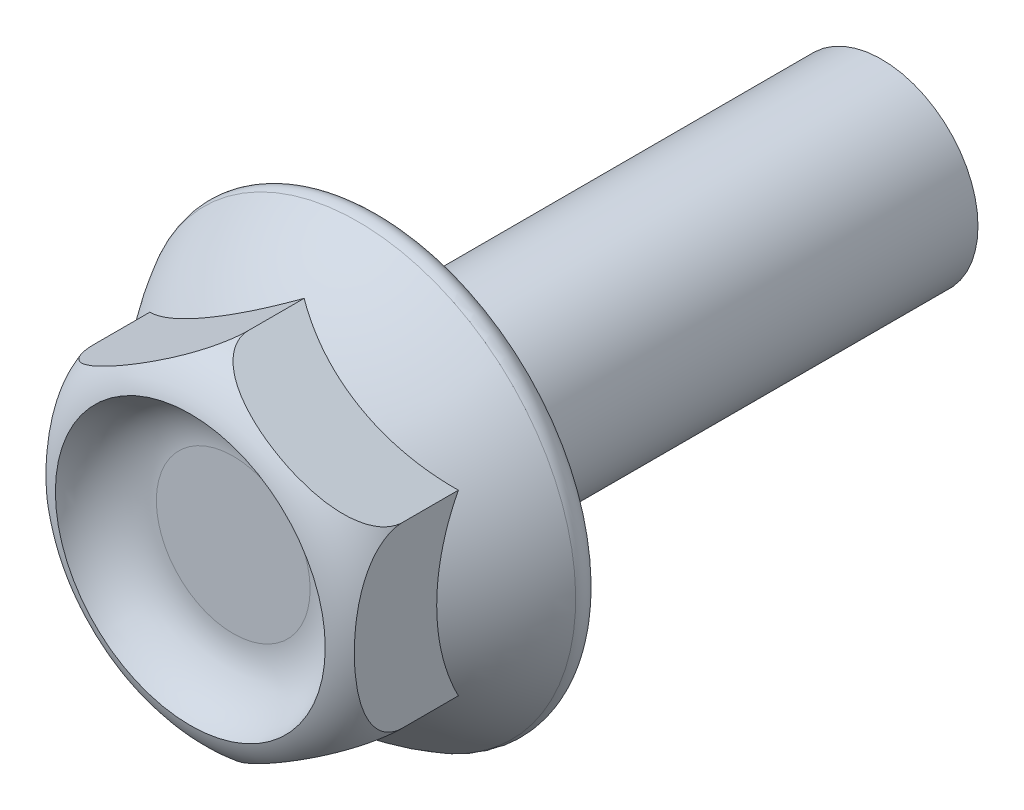
ISO-10303-21;
HEADER;
FILE_DESCRIPTION(('STEP AP214'),'2;1');
FILE_NAME('part.step','',(''),(''),'','','');
FILE_SCHEMA(('AUTOMOTIVE_DESIGN { 1 0 10303 214 1 1 1 1 }'));
ENDSEC;
DATA;
#1=APPLICATION_CONTEXT('core data for automotive mechanical design processes');
#2=APPLICATION_PROTOCOL_DEFINITION('international standard','automotive_design',2000,#1);
#3=PRODUCT_CONTEXT('',#1,'mechanical');
#4=PRODUCT('Part','Part','',(#3));
#5=PRODUCT_RELATED_PRODUCT_CATEGORY('part','',(#4));
#6=PRODUCT_DEFINITION_FORMATION('','',#4);
#7=PRODUCT_DEFINITION_CONTEXT('part definition',#1,'design');
#8=PRODUCT_DEFINITION('design','',#6,#7);
#9=PRODUCT_DEFINITION_SHAPE('','',#8);
#10=(LENGTH_UNIT() NAMED_UNIT(*) SI_UNIT(.MILLI.,.METRE.));
#11=(NAMED_UNIT(*) PLANE_ANGLE_UNIT() SI_UNIT($,.RADIAN.));
#12=(NAMED_UNIT(*) SI_UNIT($,.STERADIAN.) SOLID_ANGLE_UNIT());
#13=UNCERTAINTY_MEASURE_WITH_UNIT(LENGTH_MEASURE(1.E-05),#10,'distance_accuracy_value','');
#14=(GEOMETRIC_REPRESENTATION_CONTEXT(3) GLOBAL_UNCERTAINTY_ASSIGNED_CONTEXT((#13)) GLOBAL_UNIT_ASSIGNED_CONTEXT((#10,
#11,#12)) REPRESENTATION_CONTEXT('',''));
#15=CARTESIAN_POINT('',(0.,0.,0.));
#16=DIRECTION('',(0.,0.,1.));
#17=DIRECTION('',(1.,0.,0.));
#18=AXIS2_PLACEMENT_3D('',#15,#16,#17);
#19=CARTESIAN_POINT('',(0.,5.86587873496659,6.35));
#20=DIRECTION('',(0.500000000000001,0.866025403784438,0.));
#21=DIRECTION('',(-0.866025403784438,0.500000000000001,0.));
#22=AXIS2_PLACEMENT_3D('',#19,#20,#21);
#23=PLANE('',#22);
#24=DIRECTION('',(0.,0.,-1.));
#25=VECTOR('',#24,1.);
#26=CARTESIAN_POINT('',(0.,5.86587873496659,6.35));
#27=LINE('',#26,#25);
#28=CARTESIAN_POINT('',(0.,5.86587873496659,4.35));
#29=VERTEX_POINT('',#28);
#30=CARTESIAN_POINT('',(0.,5.86587873496659,2.51392725610466));
#31=VERTEX_POINT('',#30);
#32=EDGE_CURVE('E55',#29,#31,#27,.T.);
#33=ORIENTED_EDGE('',*,*,#32,.F.);
#34=CARTESIAN_POINT('',(1.73205119371237E-08,5.8658787249666,4.3498));
#35=CARTESIAN_POINT('',(-8.8332409814021E-06,5.86588383484065,4.37921735965277));
#36=CARTESIAN_POINT('',(0.00111489781830148,5.86523504841107,4.40861944868109));
#37=CARTESIAN_POINT('',(0.00558293377875098,5.86265542664656,4.46718078982089));
#38=CARTESIAN_POINT('',(0.00892592825202911,5.86072534788751,4.49634017496175));
#39=CARTESIAN_POINT('',(0.0221503107941925,5.85309024706693,4.58273944081772));
#40=CARTESIAN_POINT('',(0.0352285829072238,5.84553950314193,4.63936235222589));
#41=CARTESIAN_POINT('',(0.069022324886228,5.82602867711343,4.74927598053388));
#42=CARTESIAN_POINT('',(0.0897222004156251,5.81407759840434,4.80257324334787));
#43=CARTESIAN_POINT('',(0.137620523637703,5.78642348859834,4.9051880333948));
#44=CARTESIAN_POINT('',(0.164830697141963,5.77071368760096,4.95449816242364));
#45=CARTESIAN_POINT('',(0.239507067617073,5.72759926500505,5.07221484281395));
#46=CARTESIAN_POINT('',(0.290292388570505,5.69827834628171,5.13781456561909));
#47=CARTESIAN_POINT('',(0.400235584140341,5.6348026127239,5.25884259644683));
#48=CARTESIAN_POINT('',(0.459412108573482,5.60063703041271,5.3142475984221));
#49=CARTESIAN_POINT('',(0.618171503908423,5.5089772507797,5.44406160729553));
#50=CARTESIAN_POINT('',(0.721838162918047,5.44912527729451,5.51176114370447));
#51=CARTESIAN_POINT('',(0.936619233993736,5.32512136809212,5.62852759447626));
#52=CARTESIAN_POINT('',(1.04774787285762,5.26096121852938,5.67755765515471));
#53=CARTESIAN_POINT('',(1.26675794761726,5.13451569291166,5.75809401771096));
#54=CARTESIAN_POINT('',(1.37439290383616,5.07237262196447,5.79052010797972));
#55=CARTESIAN_POINT('',(1.59169629684474,4.94691244951515,5.84478770919572));
#56=CARTESIAN_POINT('',(1.70136658982473,4.88359427634104,5.8666190101469));
#57=CARTESIAN_POINT('',(1.92225717724184,4.75606303623432,5.90147382211741));
#58=CARTESIAN_POINT('',(2.03348237581865,4.69184713789533,5.91445471648294));
#59=CARTESIAN_POINT('',(2.25635349466679,4.56317243743376,5.93251260991884));
#60=CARTESIAN_POINT('',(2.36799923384862,4.49871373986326,5.93759269094453));
#61=CARTESIAN_POINT('',(2.60551753956472,4.36158248212061,5.94047120308278));
#62=CARTESIAN_POINT('',(2.73139985349996,4.28890429428388,5.93726516120935));
#63=CARTESIAN_POINT('',(2.98279387964846,4.14376188561438,5.9210478616658));
#64=CARTESIAN_POINT('',(3.10830528013154,4.07129784475911,5.90802991057953));
#65=CARTESIAN_POINT('',(3.35727136280954,3.92755720990588,5.87091883959326));
#66=CARTESIAN_POINT('',(3.48073419812838,3.85627590869963,5.84690072877571));
#67=CARTESIAN_POINT('',(3.72504839958597,3.71522103872124,5.78543143579168));
#68=CARTESIAN_POINT('',(3.84590368481327,3.64544520726227,5.74800215477668));
#69=CARTESIAN_POINT('',(4.04367664608343,3.53126093483451,5.67132288322251));
#70=CARTESIAN_POINT('',(4.12194187341124,3.48607448476861,5.63674290108095));
#71=CARTESIAN_POINT('',(4.27517213493171,3.39760695203177,5.55854944732659));
#72=CARTESIAN_POINT('',(4.3501340591906,3.35432766488193,5.51492767460828));
#73=CARTESIAN_POINT('',(4.49546818484468,3.27041896831311,5.41675845997038));
#74=CARTESIAN_POINT('',(4.56579441950804,3.22981609779912,5.36211864222592));
#75=CARTESIAN_POINT('',(4.69816688001565,3.15339082209176,5.24071561558516));
#76=CARTESIAN_POINT('',(4.76022923926691,3.11755910227151,5.17397664787848));
#77=CARTESIAN_POINT('',(4.85461371573109,3.06306619937759,5.05034498953979));
#78=CARTESIAN_POINT('',(4.89019869719668,3.04252120074932,4.99678608914583));
#79=CARTESIAN_POINT('',(4.95365430110938,3.00588509074874,4.8838301073324));
#80=CARTESIAN_POINT('',(4.98153101035409,2.98979046516218,4.82443768284238));
#81=CARTESIAN_POINT('',(5.02475483276112,2.96483517966007,4.70876570874048));
#82=CARTESIAN_POINT('',(5.04124870984452,2.955312435286,4.65306014147761));
#83=CARTESIAN_POINT('',(5.0658589379944,2.94110371343884,4.53929930283942));
#84=CARTESIAN_POINT('',(5.07399454706269,2.93640661735325,4.48124975462469));
#85=CARTESIAN_POINT('',(5.07924213680267,2.93337692000427,4.39855439433402));
#86=CARTESIAN_POINT('',(5.08001600533595,2.93293012679826,4.37417167502324));
#87=CARTESIAN_POINT('',(5.07999998267959,2.93293937748323,4.34980000000001));
#88=B_SPLINE_CURVE_WITH_KNOTS('',3,(#34,#35,#36,#37,#38,#39,#40,#41,#42,#43,#44,#45,#46,#47,#48,
#49,#50,#51,#52,#53,#54,#55,#56,#57,#58,#59,#60,#61,#62,#63,#64,#65,#66,#67,#68,#69,#70,#71,#72,
#73,#74,#75,#76,#77,#78,#79,#80,#81,#82,#83,#84,#85,#86,#87),.UNSPECIFIED.,.F.,.F.,(4,2,2,2,2,2,
2,2,2,2,2,2,2,2,2,2,2,2,2,2,2,2,2,2,2,2,4),(0.,0.0881936096410174,0.176335189095027,
0.35125145478558,0.525811800468274,0.700688948534251,0.963163648168834,1.2262311292228,
1.63647394701996,2.0475224399795,2.43229689210506,2.81744141132249,3.20442763074213,
3.59126285638533,4.02712536158759,4.46328546968383,4.89651473390057,5.32903971237568,
5.61894358996784,5.90911481142715,6.20182834379283,6.49396176572394,6.69578887974842,
6.89745616392338,7.07332096542269,7.2487796478312,7.32190975611919),.UNSPECIFIED.);
#89=CARTESIAN_POINT('',(5.08,2.93293936748328,4.35));
#90=VERTEX_POINT('',#89);
#91=EDGE_CURVE('E48',#29,#90,#88,.T.);
#92=ORIENTED_EDGE('',*,*,#91,.T.);
#93=DIRECTION('',(0.,0.,-1.));
#94=VECTOR('',#93,1.);
#95=CARTESIAN_POINT('',(5.08,2.93293936748328,6.35));
#96=LINE('',#95,#94);
#97=CARTESIAN_POINT('',(5.08,2.93293936748328,2.51392725610466));
#98=VERTEX_POINT('',#97);
#99=EDGE_CURVE('E95',#90,#98,#96,.T.);
#100=ORIENTED_EDGE('',*,*,#99,.T.);
#101=CARTESIAN_POINT('',(2.54,4.39940905122494,-3.163295125));
#102=DIRECTION('',(0.500000000000001,0.866025403784438,0.));
#103=DIRECTION('',(-0.866025403784438,0.500000000000001,0.));
#104=AXIS2_PLACEMENT_3D('',#101,#102,#103);
#105=CIRCLE('',#104,6.39006942824951);
#106=EDGE_CURVE('E111',#98,#31,#105,.F.);
#107=ORIENTED_EDGE('',*,*,#106,.T.);
#108=EDGE_LOOP('',(#33,#92,#100,#107));
#109=FACE_BOUND('',#108,.T.);
#110=ADVANCED_FACE('F32',(#109),#23,.T.);
#111=CARTESIAN_POINT('',(5.08,2.93293936748328,6.35));
#112=DIRECTION('',(1.,0.,0.));
#113=DIRECTION('',(0.,0.,-1.));
#114=AXIS2_PLACEMENT_3D('',#111,#112,#113);
#115=PLANE('',#114);
#116=ORIENTED_EDGE('',*,*,#99,.F.);
#117=CARTESIAN_POINT('',(5.08,0.,5.93931103116843));
#118=CARTESIAN_POINT('',(5.08,-0.128406018763927,5.93931222544602));
#119=CARTESIAN_POINT('',(5.08,-0.256815208471439,5.93561800556159));
#120=CARTESIAN_POINT('',(5.08,-0.513257632380873,5.92052867881341));
#121=CARTESIAN_POINT('',(5.08,-0.641290642977389,5.90912966872429));
#122=CARTESIAN_POINT('',(5.08,-0.896091515794616,5.87770867369142));
#123=CARTESIAN_POINT('',(5.08,-1.02286122075891,5.85770203567101));
#124=CARTESIAN_POINT('',(5.08,-1.27430570837632,5.80749417544982));
#125=CARTESIAN_POINT('',(5.08,-1.39898241413378,5.77730291788913));
#126=CARTESIAN_POINT('',(5.08,-1.63060992207727,5.70861727364401));
#127=CARTESIAN_POINT('',(5.08,-1.73795335538443,5.67147283566331));
#128=CARTESIAN_POINT('',(5.08,-1.94803197222505,5.58527369373639));
#129=CARTESIAN_POINT('',(5.08,-2.05076146002238,5.5362047236011));
#130=CARTESIAN_POINT('',(5.08,-2.24973945263147,5.4229872368293));
#131=CARTESIAN_POINT('',(5.08,-2.34587152068299,5.35862913843172));
#132=CARTESIAN_POINT('',(5.08,-2.52424334840148,5.21289028808471));
#133=CARTESIAN_POINT('',(5.08,-2.60654318861829,5.13158678200762));
#134=CARTESIAN_POINT('',(5.08,-2.71790755101677,4.99066893058166));
#135=CARTESIAN_POINT('',(5.08,-2.75454547149407,4.93703319071446));
#136=CARTESIAN_POINT('',(5.08,-2.81888837477423,4.82459627040611));
#137=CARTESIAN_POINT('',(5.08,-2.84659875597864,4.76579823903394));
#138=CARTESIAN_POINT('',(5.08,-2.89138534396048,4.64367398831319));
#139=CARTESIAN_POINT('',(5.08,-2.90837305597831,4.58031477436736));
#140=CARTESIAN_POINT('',(5.08,-2.92988244238737,4.45150975790325));
#141=CARTESIAN_POINT('',(5.08,-2.93441260269651,4.38606540650797));
#142=CARTESIAN_POINT('',(5.08,-2.930828965772,4.26294069689448));
#143=CARTESIAN_POINT('',(5.08,-2.92408128168369,4.20521577048942));
#144=CARTESIAN_POINT('',(5.08,-2.90097579232433,4.09173912708922));
#145=CARTESIAN_POINT('',(5.08,-2.8846170629169,4.03598760039015));
#146=CARTESIAN_POINT('',(5.08,-2.84332976141734,3.92769611905693));
#147=CARTESIAN_POINT('',(5.08,-2.8183874850017,3.87516145937559));
#148=CARTESIAN_POINT('',(5.08,-2.76129989808952,3.77420078371417));
#149=CARTESIAN_POINT('',(5.08,-2.72915156958153,3.72577650097611));
#150=CARTESIAN_POINT('',(5.08,-2.64005138622743,3.60845196973405));
#151=CARTESIAN_POINT('',(5.08,-2.57907635059011,3.54260324604756));
#152=CARTESIAN_POINT('',(5.08,-2.44745592071216,3.42140867324789));
#153=CARTESIAN_POINT('',(5.08,-2.37678610181218,3.36609022198544));
#154=CARTESIAN_POINT('',(5.08,-2.18656061981978,3.2361140772928));
#155=CARTESIAN_POINT('',(5.08,-2.06220013631206,3.16854288811915));
#156=CARTESIAN_POINT('',(5.08,-1.80499132887189,3.05263850719054));
#157=CARTESIAN_POINT('',(5.08,-1.67212664875558,3.00434376380855));
#158=CARTESIAN_POINT('',(5.08,-1.40954660029552,2.92528413579039));
#159=CARTESIAN_POINT('',(5.08,-1.28007493607304,2.89368553204411));
#160=CARTESIAN_POINT('',(5.08,-1.01887286412277,2.84147402207231));
#161=CARTESIAN_POINT('',(5.08,-0.887140363580464,2.82087193196388));
#162=CARTESIAN_POINT('',(5.08,-0.621936123648095,2.78883586654607));
#163=CARTESIAN_POINT('',(5.08,-0.48845900238243,2.7774477872338));
#164=CARTESIAN_POINT('',(5.08,-0.221128150383743,2.7629901948841));
#165=CARTESIAN_POINT('',(5.08,-0.087274601768512,2.75991718331907));
#166=CARTESIAN_POINT('',(5.08,0.196841634949649,2.76190166981298));
#167=CARTESIAN_POINT('',(5.08,0.347098431115192,2.76800525241483));
#168=CARTESIAN_POINT('',(5.08,0.646943625856298,2.79102572066017));
#169=CARTESIAN_POINT('',(5.08,0.796531336117898,2.8079519287503));
#170=CARTESIAN_POINT('',(5.08,1.09302996111681,2.85441671152725));
#171=CARTESIAN_POINT('',(5.08,1.23995057797026,2.88389117131835));
#172=CARTESIAN_POINT('',(5.08,1.52962744946796,2.95852548771936));
#173=CARTESIAN_POINT('',(5.08,1.67239162078481,3.00365307798382));
#174=CARTESIAN_POINT('',(5.08,1.93881383071237,3.10948120211427));
#175=CARTESIAN_POINT('',(5.08,2.06308036955532,3.16861073763079));
#176=CARTESIAN_POINT('',(5.08,2.29903981247179,3.30791618381836));
#177=CARTESIAN_POINT('',(5.08,2.41080117816544,3.38796859284178));
#178=CARTESIAN_POINT('',(5.08,2.56285153954697,3.52750922408576));
#179=CARTESIAN_POINT('',(5.08,2.61141167644839,3.57798090134302));
#180=CARTESIAN_POINT('',(5.08,2.70073176791262,3.68553995274877));
#181=CARTESIAN_POINT('',(5.08,2.74149024334158,3.74262857813123));
#182=CARTESIAN_POINT('',(5.08,2.81319985323495,3.86356204880188));
#183=CARTESIAN_POINT('',(5.08,2.84404594194435,3.92747027251439));
#184=CARTESIAN_POINT('',(5.08,2.89283069774621,4.06004265903072));
#185=CARTESIAN_POINT('',(5.08,2.91078777234826,4.12869988515734));
#186=CARTESIAN_POINT('',(5.08,2.93082892206014,4.26014825179101));
#187=CARTESIAN_POINT('',(5.08,2.93451250440174,4.32269611859209));
#188=CARTESIAN_POINT('',(5.08,2.93013860153054,4.44737352978146));
#189=CARTESIAN_POINT('',(5.08,2.92208339518955,4.50950315301199));
#190=CARTESIAN_POINT('',(5.08,2.89618691459551,4.62560674905295));
#191=CARTESIAN_POINT('',(5.08,2.87931940840787,4.67980363110395));
#192=CARTESIAN_POINT('',(5.08,2.83754728943211,4.78497656057663));
#193=CARTESIAN_POINT('',(5.08,2.81264039856166,4.83595169016382));
#194=CARTESIAN_POINT('',(5.08,2.7451853872528,4.95273820272454));
#195=CARTESIAN_POINT('',(5.08,2.69953409416151,5.01675688748763));
#196=CARTESIAN_POINT('',(5.08,2.59850726503045,5.13657179815197));
#197=CARTESIAN_POINT('',(5.08,2.54311293797314,5.19235174475702));
#198=CARTESIAN_POINT('',(5.08,2.39724114560304,5.32057394950502));
#199=CARTESIAN_POINT('',(5.08,2.30262852443792,5.38828145684921));
#200=CARTESIAN_POINT('',(5.08,2.10421245817008,5.50846181046753));
#201=CARTESIAN_POINT('',(5.08,2.00038658641986,5.56089607381954));
#202=CARTESIAN_POINT('',(5.08,1.79980021554563,5.64760819522685));
#203=CARTESIAN_POINT('',(5.08,1.70363235904793,5.68329190202944));
#204=CARTESIAN_POINT('',(5.08,1.50854845178073,5.746291419206));
#205=CARTESIAN_POINT('',(5.08,1.40963010015192,5.77359997892871));
#206=CARTESIAN_POINT('',(5.08,1.21006932547022,5.82111721450031));
#207=CARTESIAN_POINT('',(5.08,1.10942586120308,5.84132143195831));
#208=CARTESIAN_POINT('',(5.08,0.907159140555265,5.87560134005104));
#209=CARTESIAN_POINT('',(5.08,0.805536263625741,5.88967931373577));
#210=CARTESIAN_POINT('',(5.08,0.586841864309721,5.91410586017958));
#211=CARTESIAN_POINT('',(5.08,0.469677203696405,5.92361196783077));
#212=CARTESIAN_POINT('',(5.08,0.23500925992481,5.93621419115479));
#213=CARTESIAN_POINT('',(5.08,0.117505957685565,5.93930993827004));
#214=CARTESIAN_POINT('',(5.08,0.,5.93931103116843));
#215=B_SPLINE_CURVE_WITH_KNOTS('',3,(#117,#118,#119,#120,#121,#122,#123,#124,#125,#126,#127,
#128,#129,#130,#131,#132,#133,#134,#135,#136,#137,#138,#139,#140,#141,#142,#143,#144,#145,#146,
#147,#148,#149,#150,#151,#152,#153,#154,#155,#156,#157,#158,#159,#160,#161,#162,#163,#164,#165,
#166,#167,#168,#169,#170,#171,#172,#173,#174,#175,#176,#177,#178,#179,#180,#181,#182,#183,#184,
#185,#186,#187,#188,#189,#190,#191,#192,#193,#194,#195,#196,#197,#198,#199,#200,#201,#202,#203,
#204,#205,#206,#207,#208,#209,#210,#211,#212,#213,#214),.UNSPECIFIED.,.T.,.F.,(4,2,2,2,2,2,2,2,
2,2,2,2,2,2,2,2,2,2,2,2,2,2,2,2,2,2,2,2,2,2,2,2,2,2,2,2,2,2,2,2,2,2,2,2,2,2,2,2,4),(0.,
0.385167841014202,0.77053095337983,1.15520981362871,1.5395133901456,1.87972773512272,
2.22035112468588,2.56594461872192,2.90999588883431,3.10418347879689,3.29825342393606,
3.49390478783131,3.68942284357659,3.862928251776,4.03645034587204,4.21025077722695,
4.38412413547961,4.65182364223472,4.92021040924057,5.34241470023154,5.76545695207581,
6.1646865630636,6.56430813408407,6.96590821675103,7.36733930168355,7.81812564204902,
8.26930080705116,8.71819786274777,9.16617503687885,9.57760193389076,9.98665309004678,
10.1961735186034,10.4057336313299,10.6174464274216,10.8288562599478,11.0157449051236,
11.2025972741088,11.3721718568349,11.5417945333528,11.77636512315,12.0113931829203,
12.3584724942416,12.7064211329301,13.013699816655,13.321243775951,13.6289803940773,
13.9366022304475,14.2890538875641,14.6415258079907),.UNSPECIFIED.);
#216=CARTESIAN_POINT('',(5.08,-2.93293936748328,4.35));
#217=VERTEX_POINT('',#216);
#218=EDGE_CURVE('E85',#90,#217,#215,.T.);
#219=ORIENTED_EDGE('',*,*,#218,.T.);
#220=DIRECTION('',(0.,0.,-1.));
#221=VECTOR('',#220,1.);
#222=CARTESIAN_POINT('',(5.08,-2.93293936748328,6.35));
#223=LINE('',#222,#221);
#224=CARTESIAN_POINT('',(5.08,-2.93293936748328,2.51392725610466));
#225=VERTEX_POINT('',#224);
#226=EDGE_CURVE('E103',#217,#225,#223,.T.);
#227=ORIENTED_EDGE('',*,*,#226,.T.);
#228=CARTESIAN_POINT('',(5.08,0.,-3.163295125));
#229=DIRECTION('',(1.,0.,0.));
#230=DIRECTION('',(0.,0.,-1.));
#231=AXIS2_PLACEMENT_3D('',#228,#229,#230);
#232=CIRCLE('',#231,6.3900694282495);
#233=EDGE_CURVE('E102',#225,#98,#232,.F.);
#234=ORIENTED_EDGE('',*,*,#233,.T.);
#235=EDGE_LOOP('',(#116,#219,#227,#234));
#236=FACE_BOUND('',#235,.T.);
#237=ADVANCED_FACE('F100',(#236),#115,.T.);
#238=CARTESIAN_POINT('',(5.08,-2.93293936748328,6.35));
#239=DIRECTION('',(0.500000000000001,-0.866025403784438,0.));
#240=DIRECTION('',(0.866025403784438,0.500000000000001,0.));
#241=AXIS2_PLACEMENT_3D('',#238,#239,#240);
#242=PLANE('',#241);
#243=ORIENTED_EDGE('',*,*,#226,.F.);
#244=CARTESIAN_POINT('',(5.07999998267949,-2.93293937748328,4.3498));
#245=CARTESIAN_POINT('',(5.08000883324098,-2.93293426760923,4.37921735965277));
#246=CARTESIAN_POINT('',(5.0788851021817,-2.9335830540388,4.40861944868109));
#247=CARTESIAN_POINT('',(5.07441706622125,-2.93616267580331,4.46718078982089));
#248=CARTESIAN_POINT('',(5.07107407174797,-2.93809275456236,4.49634017496175));
#249=CARTESIAN_POINT('',(5.05784968920581,-2.94572785538294,4.58273944081772));
#250=CARTESIAN_POINT('',(5.04477141709278,-2.95327859930794,4.63936235222589));
#251=CARTESIAN_POINT('',(5.01097767511377,-2.97278942533644,4.74927598053388));
#252=CARTESIAN_POINT('',(4.99027779958437,-2.98474050404553,4.80257324334787));
#253=CARTESIAN_POINT('',(4.9423794763623,-3.01239461385153,4.9051880333948));
#254=CARTESIAN_POINT('',(4.91516930285804,-3.02810441484891,4.95449816242364));
#255=CARTESIAN_POINT('',(4.84049293238293,-3.07121883744482,5.07221484281395));
#256=CARTESIAN_POINT('',(4.78970761142949,-3.10053975616816,5.13781456561909));
#257=CARTESIAN_POINT('',(4.67976441585966,-3.16401548972598,5.25884259644683));
#258=CARTESIAN_POINT('',(4.62058789142652,-3.19818107203716,5.3142475984221));
#259=CARTESIAN_POINT('',(4.46182849609158,-3.28984085167017,5.44406160729553));
#260=CARTESIAN_POINT('',(4.35816183708195,-3.34969282515536,5.51176114370447));
#261=CARTESIAN_POINT('',(4.14338076600626,-3.47369673435775,5.62852759447626));
#262=CARTESIAN_POINT('',(4.03225212714238,-3.53785688392049,5.67755765515471));
#263=CARTESIAN_POINT('',(3.81324205238273,-3.66430240953821,5.75809401771096));
#264=CARTESIAN_POINT('',(3.70560709616384,-3.7264454804854,5.79052010797972));
#265=CARTESIAN_POINT('',(3.48830370315526,-3.85190565293473,5.84478770919572));
#266=CARTESIAN_POINT('',(3.37863341017527,-3.91522382610883,5.8666190101469));
#267=CARTESIAN_POINT('',(3.15774282275816,-4.04275506621555,5.90147382211741));
#268=CARTESIAN_POINT('',(3.04651762418135,-4.10697096455454,5.91445471648294));
#269=CARTESIAN_POINT('',(2.82364650533321,-4.23564566501611,5.93251260991884));
#270=CARTESIAN_POINT('',(2.71200076615137,-4.30010436258662,5.93759269094453));
#271=CARTESIAN_POINT('',(2.47448246043528,-4.43723562032927,5.94047120308278));
#272=CARTESIAN_POINT('',(2.34860014650004,-4.509913808166,5.93726516120935));
#273=CARTESIAN_POINT('',(2.09720612035154,-4.6550562168355,5.9210478616658));
#274=CARTESIAN_POINT('',(1.97169471986846,-4.72752025769077,5.90802991057953));
#275=CARTESIAN_POINT('',(1.72272863719046,-4.871260892544,5.87091883959326));
#276=CARTESIAN_POINT('',(1.59926580187162,-4.94254219375025,5.84690072877571));
#277=CARTESIAN_POINT('',(1.35495160041403,-5.08359706372863,5.78543143579168));
#278=CARTESIAN_POINT('',(1.23409631518673,-5.1533728951876,5.74800215477668));
#279=CARTESIAN_POINT('',(1.03632335391657,-5.26755716761536,5.67132288322251));
#280=CARTESIAN_POINT('',(0.958058126588757,-5.31274361768126,5.63674290108095));
#281=CARTESIAN_POINT('',(0.804827865068285,-5.4012111504181,5.55854944732659));
#282=CARTESIAN_POINT('',(0.7298659408094,-5.44449043756794,5.51492767460828));
#283=CARTESIAN_POINT('',(0.584531815155313,-5.52839913413677,5.41675845997038));
#284=CARTESIAN_POINT('',(0.514205580491954,-5.56900200465075,5.36211864222592));
#285=CARTESIAN_POINT('',(0.381833119984349,-5.64542728035811,5.24071561558516));
#286=CARTESIAN_POINT('',(0.319770760733093,-5.68125900017837,5.17397664787848));
#287=CARTESIAN_POINT('',(0.22538628426891,-5.73575190307228,5.05034498953979));
#288=CARTESIAN_POINT('',(0.189801302803321,-5.75629690170055,4.99678608914583));
#289=CARTESIAN_POINT('',(0.126345698890618,-5.79293301170114,4.8838301073324));
#290=CARTESIAN_POINT('',(0.0984689896459049,-5.80902763728769,4.82443768284237));
#291=CARTESIAN_POINT('',(0.0552451672388727,-5.8339829227898,4.70876570874048));
#292=CARTESIAN_POINT('',(0.0387512901554802,-5.84350566716388,4.65306014147761));
#293=CARTESIAN_POINT('',(0.0141410620055928,-5.85771438901103,4.53929930283942));
#294=CARTESIAN_POINT('',(0.00600545293730663,-5.86241148509663,4.48124975462469));
#295=CARTESIAN_POINT('',(0.000757863197325228,-5.8654411824456,4.39855439433402));
#296=CARTESIAN_POINT('',(-1.60053359537951E-05,-5.86588797565161,4.37417167502324));
#297=CARTESIAN_POINT('',(1.73204108631173E-08,-5.86587872496664,4.34980000000001));
#298=B_SPLINE_CURVE_WITH_KNOTS('',3,(#244,#245,#246,#247,#248,#249,#250,#251,#252,#253,#254,
#255,#256,#257,#258,#259,#260,#261,#262,#263,#264,#265,#266,#267,#268,#269,#270,#271,#272,#273,
#274,#275,#276,#277,#278,#279,#280,#281,#282,#283,#284,#285,#286,#287,#288,#289,#290,#291,#292,
#293,#294,#295,#296,#297),.UNSPECIFIED.,.F.,.F.,(4,2,2,2,2,2,2,2,2,2,2,2,2,2,2,2,2,2,2,2,2,2,2,
2,2,2,4),(0.,0.0881936096410172,0.176335189095027,0.35125145478558,0.525811800468273,
0.700688948534251,0.963163648168833,1.2262311292228,1.63647394701996,2.0475224399795,
2.43229689210506,2.81744141132249,3.20442763074213,3.59126285638533,4.02712536158759,
4.46328546968383,4.89651473390057,5.32903971237568,5.61894358996784,5.90911481142715,
6.20182834379283,6.49396176572394,6.69578887974842,6.89745616392338,7.07332096542269,
7.2487796478312,7.32190975611919),.UNSPECIFIED.);
#299=CARTESIAN_POINT('',(0.,-5.86587873496659,4.35));
#300=VERTEX_POINT('',#299);
#301=EDGE_CURVE('E88',#217,#300,#298,.T.);
#302=ORIENTED_EDGE('',*,*,#301,.T.);
#303=DIRECTION('',(0.,0.,-1.));
#304=VECTOR('',#303,1.);
#305=CARTESIAN_POINT('',(0.,-5.86587873496659,6.35));
#306=LINE('',#305,#304);
#307=CARTESIAN_POINT('',(0.,-5.86587873496659,2.51392725610466));
#308=VERTEX_POINT('',#307);
#309=EDGE_CURVE('E105',#300,#308,#306,.T.);
#310=ORIENTED_EDGE('',*,*,#309,.T.);
#311=CARTESIAN_POINT('',(2.54,-4.39940905122494,-3.163295125));
#312=DIRECTION('',(0.500000000000001,-0.866025403784438,0.));
#313=DIRECTION('',(0.866025403784438,0.500000000000001,0.));
#314=AXIS2_PLACEMENT_3D('',#311,#312,#313);
#315=CIRCLE('',#314,6.39006942824951);
#316=EDGE_CURVE('E321',#308,#225,#315,.F.);
#317=ORIENTED_EDGE('',*,*,#316,.T.);
#318=EDGE_LOOP('',(#243,#302,#310,#317));
#319=FACE_BOUND('',#318,.T.);
#320=ADVANCED_FACE('F168',(#319),#242,.T.);
#321=CARTESIAN_POINT('',(0.,-5.86587873496659,6.35));
#322=DIRECTION('',(-0.5,-0.866025403784438,0.));
#323=DIRECTION('',(0.866025403784438,-0.500000000000001,0.));
#324=AXIS2_PLACEMENT_3D('',#321,#322,#323);
#325=PLANE('',#324);
#326=ORIENTED_EDGE('',*,*,#309,.F.);
#327=CARTESIAN_POINT('',(-1.73205119371237E-08,-5.8658787249666,4.3498));
#328=CARTESIAN_POINT('',(8.83324098140373E-06,-5.86588383484065,4.37921735965277));
#329=CARTESIAN_POINT('',(-0.00111489781830148,-5.86523504841107,4.40861944868109));
#330=CARTESIAN_POINT('',(-0.00558293377875099,-5.86265542664656,4.46718078982089));
#331=CARTESIAN_POINT('',(-0.00892592825202912,-5.86072534788751,4.49634017496175));
#332=CARTESIAN_POINT('',(-0.0221503107941925,-5.85309024706693,4.58273944081772));
#333=CARTESIAN_POINT('',(-0.0352285829072239,-5.84553950314193,4.63936235222589));
#334=CARTESIAN_POINT('',(-0.0690223248862281,-5.82602867711343,4.74927598053388));
#335=CARTESIAN_POINT('',(-0.0897222004156252,-5.81407759840434,4.80257324334787));
#336=CARTESIAN_POINT('',(-0.137620523637703,-5.78642348859834,4.9051880333948));
#337=CARTESIAN_POINT('',(-0.164830697141963,-5.77071368760096,4.95449816242364));
#338=CARTESIAN_POINT('',(-0.239507067617073,-5.72759926500505,5.07221484281395));
#339=CARTESIAN_POINT('',(-0.290292388570505,-5.69827834628171,5.13781456561909));
#340=CARTESIAN_POINT('',(-0.400235584140341,-5.6348026127239,5.25884259644683));
#341=CARTESIAN_POINT('',(-0.459412108573482,-5.60063703041271,5.3142475984221));
#342=CARTESIAN_POINT('',(-0.618171503908423,-5.50897725077971,5.44406160729553));
#343=CARTESIAN_POINT('',(-0.721838162918046,-5.44912527729451,5.51176114370447));
#344=CARTESIAN_POINT('',(-0.936619233993735,-5.32512136809212,5.62852759447626));
#345=CARTESIAN_POINT('',(-1.04774787285762,-5.26096121852939,5.67755765515471));
#346=CARTESIAN_POINT('',(-1.26675794761726,-5.13451569291166,5.75809401771096));
#347=CARTESIAN_POINT('',(-1.37439290383615,-5.07237262196447,5.79052010797972));
#348=CARTESIAN_POINT('',(-1.59169629684474,-4.94691244951515,5.84478770919572));
#349=CARTESIAN_POINT('',(-1.70136658982473,-4.88359427634105,5.8666190101469));
#350=CARTESIAN_POINT('',(-1.92225717724184,-4.75606303623432,5.90147382211741));
#351=CARTESIAN_POINT('',(-2.03348237581865,-4.69184713789533,5.91445471648294));
#352=CARTESIAN_POINT('',(-2.25635349466679,-4.56317243743377,5.93251260991884));
#353=CARTESIAN_POINT('',(-2.36799923384862,-4.49871373986326,5.93759269094453));
#354=CARTESIAN_POINT('',(-2.60551753956471,-4.36158248212061,5.94047120308278));
#355=CARTESIAN_POINT('',(-2.73139985349996,-4.28890429428388,5.93726516120935));
#356=CARTESIAN_POINT('',(-2.98279387964846,-4.14376188561438,5.9210478616658));
#357=CARTESIAN_POINT('',(-3.10830528013153,-4.07129784475911,5.90802991057953));
#358=CARTESIAN_POINT('',(-3.35727136280953,-3.92755720990588,5.87091883959326));
#359=CARTESIAN_POINT('',(-3.48073419812838,-3.85627590869963,5.84690072877571));
#360=CARTESIAN_POINT('',(-3.72504839958596,-3.71522103872125,5.78543143579168));
#361=CARTESIAN_POINT('',(-3.84590368481326,-3.64544520726227,5.74800215477668));
#362=CARTESIAN_POINT('',(-4.04367664608343,-3.53126093483452,5.67132288322251));
#363=CARTESIAN_POINT('',(-4.12194187341124,-3.48607448476862,5.63674290108095));
#364=CARTESIAN_POINT('',(-4.27517213493171,-3.39760695203178,5.55854944732659));
#365=CARTESIAN_POINT('',(-4.35013405919059,-3.35432766488194,5.51492767460828));
#366=CARTESIAN_POINT('',(-4.49546818484468,-3.27041896831311,5.41675845997038));
#367=CARTESIAN_POINT('',(-4.56579441950804,-3.22981609779913,5.36211864222592));
#368=CARTESIAN_POINT('',(-4.69816688001564,-3.15339082209177,5.24071561558516));
#369=CARTESIAN_POINT('',(-4.7602292392669,-3.11755910227151,5.17397664787848));
#370=CARTESIAN_POINT('',(-4.85461371573109,-3.06306619937759,5.0503449895398));
#371=CARTESIAN_POINT('',(-4.89019869719667,-3.04252120074933,4.99678608914583));
#372=CARTESIAN_POINT('',(-4.95365430110938,-3.00588509074874,4.8838301073324));
#373=CARTESIAN_POINT('',(-4.98153101035409,-2.98979046516218,4.82443768284238));
#374=CARTESIAN_POINT('',(-5.02475483276112,-2.96483517966008,4.70876570874048));
#375=CARTESIAN_POINT('',(-5.04124870984452,-2.955312435286,4.65306014147762));
#376=CARTESIAN_POINT('',(-5.0658589379944,-2.94110371343885,4.53929930283942));
#377=CARTESIAN_POINT('',(-5.07399454706269,-2.93640661735325,4.48124975462469));
#378=CARTESIAN_POINT('',(-5.07924213680267,-2.93337692000427,4.39855439433402));
#379=CARTESIAN_POINT('',(-5.08001600533595,-2.93293012679827,4.37417167502324));
#380=CARTESIAN_POINT('',(-5.07999998267958,-2.93293937748323,4.34980000000001));
#381=B_SPLINE_CURVE_WITH_KNOTS('',3,(#327,#328,#329,#330,#331,#332,#333,#334,#335,#336,#337,
#338,#339,#340,#341,#342,#343,#344,#345,#346,#347,#348,#349,#350,#351,#352,#353,#354,#355,#356,
#357,#358,#359,#360,#361,#362,#363,#364,#365,#366,#367,#368,#369,#370,#371,#372,#373,#374,#375,
#376,#377,#378,#379,#380),.UNSPECIFIED.,.F.,.F.,(4,2,2,2,2,2,2,2,2,2,2,2,2,2,2,2,2,2,2,2,2,2,2,
2,2,2,4),(0.,0.0881936096410174,0.176335189095027,0.35125145478558,0.525811800468274,
0.700688948534251,0.963163648168833,1.2262311292228,1.63647394701996,2.04752243997949,
2.43229689210506,2.81744141132248,3.20442763074213,3.59126285638533,4.02712536158758,
4.46328546968383,4.89651473390056,5.32903971237567,5.61894358996783,5.90911481142714,
6.20182834379282,6.49396176572393,6.69578887974841,6.89745616392337,7.07332096542268,
7.24877964783119,7.32190975611918),.UNSPECIFIED.);
#382=CARTESIAN_POINT('',(-5.08,-2.93293936748328,4.35));
#383=VERTEX_POINT('',#382);
#384=EDGE_CURVE('E145',#300,#383,#381,.T.);
#385=ORIENTED_EDGE('',*,*,#384,.T.);
#386=DIRECTION('',(0.,0.,-1.));
#387=VECTOR('',#386,1.);
#388=CARTESIAN_POINT('',(-5.08,-2.93293936748329,6.35));
#389=LINE('',#388,#387);
#390=CARTESIAN_POINT('',(-5.08,-2.93293936748328,2.51392725610466));
#391=VERTEX_POINT('',#390);
#392=EDGE_CURVE('E317',#383,#391,#389,.T.);
#393=ORIENTED_EDGE('',*,*,#392,.T.);
#394=CARTESIAN_POINT('',(-2.54,-4.39940905122494,-3.163295125));
#395=DIRECTION('',(-0.5,-0.866025403784438,0.));
#396=DIRECTION('',(0.866025403784438,-0.500000000000001,0.));
#397=AXIS2_PLACEMENT_3D('',#394,#395,#396);
#398=CIRCLE('',#397,6.39006942824951);
#399=EDGE_CURVE('E327',#391,#308,#398,.F.);
#400=ORIENTED_EDGE('',*,*,#399,.T.);
#401=EDGE_LOOP('',(#326,#385,#393,#400));
#402=FACE_BOUND('',#401,.T.);
#403=ADVANCED_FACE('F184',(#402),#325,.T.);
#404=CARTESIAN_POINT('',(-5.08,-2.93293936748329,6.35));
#405=DIRECTION('',(-1.,0.,0.));
#406=DIRECTION('',(0.,-1.,0.));
#407=AXIS2_PLACEMENT_3D('',#404,#405,#406);
#408=PLANE('',#407);
#409=ORIENTED_EDGE('',*,*,#392,.F.);
#410=CARTESIAN_POINT('',(-5.08,0.,5.93931103117518));
#411=CARTESIAN_POINT('',(-5.08,0.128406018763668,5.93931222545304));
#412=CARTESIAN_POINT('',(-5.08,0.25681520847092,5.93561800556349));
#413=CARTESIAN_POINT('',(-5.08,0.513257632380122,5.92052867881159));
#414=CARTESIAN_POINT('',(-5.08,0.641290642976666,5.90912966872386));
#415=CARTESIAN_POINT('',(-5.08,0.896091515794102,5.87770867369201));
#416=CARTESIAN_POINT('',(-5.08,1.02286122075858,5.85770203567121));
#417=CARTESIAN_POINT('',(-5.08,1.27430570837622,5.80749417544971));
#418=CARTESIAN_POINT('',(-5.08,1.39898241413372,5.77730291788911));
#419=CARTESIAN_POINT('',(-5.08,1.63060992207731,5.70861727364403));
#420=CARTESIAN_POINT('',(-5.08,1.7379533553845,5.6714728356633));
#421=CARTESIAN_POINT('',(-5.08,1.94803197222512,5.58527369373635));
#422=CARTESIAN_POINT('',(-5.08,2.05076146002241,5.53620472360108));
#423=CARTESIAN_POINT('',(-5.08,2.24973945263146,5.42298723682931));
#424=CARTESIAN_POINT('',(-5.08,2.34587152068297,5.35862913843174));
#425=CARTESIAN_POINT('',(-5.08,2.52424334840145,5.21289028808474));
#426=CARTESIAN_POINT('',(-5.08,2.60654318861827,5.13158678200763));
#427=CARTESIAN_POINT('',(-5.08,2.71790755101677,4.99066893058166));
#428=CARTESIAN_POINT('',(-5.08,2.75454547149407,4.93703319071446));
#429=CARTESIAN_POINT('',(-5.08,2.81888837477423,4.82459627040611));
#430=CARTESIAN_POINT('',(-5.08,2.84659875597864,4.76579823903394));
#431=CARTESIAN_POINT('',(-5.08,2.89138534396048,4.64367398831319));
#432=CARTESIAN_POINT('',(-5.08,2.90837305597831,4.58031477436736));
#433=CARTESIAN_POINT('',(-5.08,2.92988244238737,4.45150975790325));
#434=CARTESIAN_POINT('',(-5.08,2.93441260269651,4.38606540650797));
#435=CARTESIAN_POINT('',(-5.08,2.930828965772,4.26294069689448));
#436=CARTESIAN_POINT('',(-5.08,2.92408128168369,4.20521577048942));
#437=CARTESIAN_POINT('',(-5.08,2.90097579232433,4.09173912708922));
#438=CARTESIAN_POINT('',(-5.08,2.8846170629169,4.03598760039015));
#439=CARTESIAN_POINT('',(-5.08,2.84332976141734,3.92769611905693));
#440=CARTESIAN_POINT('',(-5.08,2.8183874850017,3.87516145937559));
#441=CARTESIAN_POINT('',(-5.08,2.76129989808952,3.77420078371417));
#442=CARTESIAN_POINT('',(-5.08,2.72915156958153,3.72577650097611));
#443=CARTESIAN_POINT('',(-5.08,2.64005138622743,3.60845196973406));
#444=CARTESIAN_POINT('',(-5.08,2.57907635059011,3.54260324604756));
#445=CARTESIAN_POINT('',(-5.08,2.44745592071216,3.4214086732479));
#446=CARTESIAN_POINT('',(-5.08,2.37678610181218,3.36609022198544));
#447=CARTESIAN_POINT('',(-5.08,2.18656061981978,3.2361140772928));
#448=CARTESIAN_POINT('',(-5.08,2.06220013631206,3.16854288811915));
#449=CARTESIAN_POINT('',(-5.08,1.80499132887189,3.05263850719054));
#450=CARTESIAN_POINT('',(-5.08,1.67212664875558,3.00434376380855));
#451=CARTESIAN_POINT('',(-5.08,1.40954660029552,2.92528413579039));
#452=CARTESIAN_POINT('',(-5.08,1.28007493607304,2.89368553204412));
#453=CARTESIAN_POINT('',(-5.08,1.01887286412278,2.84147402207231));
#454=CARTESIAN_POINT('',(-5.08,0.887140363580468,2.82087193196388));
#455=CARTESIAN_POINT('',(-5.08,0.621936123648099,2.78883586654608));
#456=CARTESIAN_POINT('',(-5.08,0.488459002382434,2.7774477872338));
#457=CARTESIAN_POINT('',(-5.08,0.221128150383747,2.7629901948841));
#458=CARTESIAN_POINT('',(-5.08,0.0872746017685165,2.75991718331907));
#459=CARTESIAN_POINT('',(-5.08,-0.196841634949644,2.76190166981298));
#460=CARTESIAN_POINT('',(-5.08,-0.347098431115187,2.76800525241483));
#461=CARTESIAN_POINT('',(-5.08,-0.646943625856294,2.79102572066016));
#462=CARTESIAN_POINT('',(-5.08,-0.796531336117893,2.8079519287503));
#463=CARTESIAN_POINT('',(-5.08,-1.09302996111681,2.85441671152725));
#464=CARTESIAN_POINT('',(-5.08,-1.23995057797026,2.88389117131835));
#465=CARTESIAN_POINT('',(-5.08,-1.52962744946796,2.95852548771936));
#466=CARTESIAN_POINT('',(-5.08,-1.6723916207848,3.00365307798382));
#467=CARTESIAN_POINT('',(-5.08,-1.93881383071237,3.10948120211427));
#468=CARTESIAN_POINT('',(-5.08,-2.06308036955531,3.16861073763079));
#469=CARTESIAN_POINT('',(-5.08,-2.29903981247179,3.30791618381836));
#470=CARTESIAN_POINT('',(-5.08,-2.41080117816544,3.38796859284178));
#471=CARTESIAN_POINT('',(-5.08,-2.56285153954696,3.52750922408575));
#472=CARTESIAN_POINT('',(-5.08,-2.61141167644839,3.57798090134301));
#473=CARTESIAN_POINT('',(-5.08,-2.70073176791262,3.68553995274877));
#474=CARTESIAN_POINT('',(-5.08,-2.74149024334158,3.74262857813123));
#475=CARTESIAN_POINT('',(-5.08,-2.81319985323495,3.86356204880188));
#476=CARTESIAN_POINT('',(-5.08,-2.84404594194434,3.92747027251439));
#477=CARTESIAN_POINT('',(-5.08,-2.89283069774621,4.06004265903072));
#478=CARTESIAN_POINT('',(-5.08,-2.91078777234826,4.12869988515734));
#479=CARTESIAN_POINT('',(-5.08,-2.93082892206014,4.26014825179101));
#480=CARTESIAN_POINT('',(-5.08,-2.93451250440174,4.32269611859209));
#481=CARTESIAN_POINT('',(-5.08,-2.93013860153053,4.44737352978146));
#482=CARTESIAN_POINT('',(-5.08,-2.92208339518955,4.50950315301198));
#483=CARTESIAN_POINT('',(-5.08,-2.89618691459551,4.62560674905295));
#484=CARTESIAN_POINT('',(-5.08,-2.87931940840787,4.67980363110395));
#485=CARTESIAN_POINT('',(-5.08,-2.8375472894321,4.78497656057663));
#486=CARTESIAN_POINT('',(-5.08,-2.81264039856166,4.83595169016382));
#487=CARTESIAN_POINT('',(-5.08,-2.74518538725281,4.95273820272454));
#488=CARTESIAN_POINT('',(-5.08,-2.69953409416152,5.01675688748762));
#489=CARTESIAN_POINT('',(-5.08,-2.59850726503046,5.13657179815196));
#490=CARTESIAN_POINT('',(-5.08,-2.54311293797314,5.19235174475701));
#491=CARTESIAN_POINT('',(-5.08,-2.39724114560302,5.32057394950504));
#492=CARTESIAN_POINT('',(-5.08,-2.30262852443788,5.38828145684923));
#493=CARTESIAN_POINT('',(-5.08,-2.10421245817004,5.50846181046755));
#494=CARTESIAN_POINT('',(-5.08,-2.00038658641984,5.56089607381955));
#495=CARTESIAN_POINT('',(-5.08,-1.79980021554568,5.64760819522682));
#496=CARTESIAN_POINT('',(-5.08,-1.70363235904803,5.68329190202939));
#497=CARTESIAN_POINT('',(-5.08,-1.50854845178092,5.74629141920595));
#498=CARTESIAN_POINT('',(-5.08,-1.40963010015215,5.77359997892867));
#499=CARTESIAN_POINT('',(-5.08,-1.21006932547042,5.82111721450024));
#500=CARTESIAN_POINT('',(-5.08,-1.10942586120322,5.84132143195819));
#501=CARTESIAN_POINT('',(-5.08,-0.907159140555319,5.87560134005114));
#502=CARTESIAN_POINT('',(-5.08,-0.805536263625775,5.88967931373615));
#503=CARTESIAN_POINT('',(-5.08,-0.586841864309643,5.91410586017916));
#504=CARTESIAN_POINT('',(-5.08,-0.469677203696231,5.92361196782905));
#505=CARTESIAN_POINT('',(-5.08,-0.235009259924631,5.93621419115653));
#506=CARTESIAN_POINT('',(-5.08,-0.117505957685475,5.93930993827655));
#507=CARTESIAN_POINT('',(-5.08,0.,5.93931103117518));
#508=B_SPLINE_CURVE_WITH_KNOTS('',3,(#410,#411,#412,#413,#414,#415,#416,#417,#418,#419,#420,
#421,#422,#423,#424,#425,#426,#427,#428,#429,#430,#431,#432,#433,#434,#435,#436,#437,#438,#439,
#440,#441,#442,#443,#444,#445,#446,#447,#448,#449,#450,#451,#452,#453,#454,#455,#456,#457,#458,
#459,#460,#461,#462,#463,#464,#465,#466,#467,#468,#469,#470,#471,#472,#473,#474,#475,#476,#477,
#478,#479,#480,#481,#482,#483,#484,#485,#486,#487,#488,#489,#490,#491,#492,#493,#494,#495,#496,
#497,#498,#499,#500,#501,#502,#503,#504,#505,#506,#507),.UNSPECIFIED.,.T.,.F.,(4,2,2,2,2,2,2,2,
2,2,2,2,2,2,2,2,2,2,2,2,2,2,2,2,2,2,2,2,2,2,2,2,2,2,2,2,2,2,2,2,2,2,2,2,2,2,2,2,4),(0.,
0.385167841013673,0.770530953379314,1.15520981362875,1.5395133901458,1.87972773512303,
2.22035112468607,2.56594461872207,2.9099958888345,3.1041834787971,3.29825342393625,
3.49390478783151,3.68942284357679,3.8629282517762,4.03645034587224,4.21025077722714,
4.3841241354798,4.65182364223492,4.92021040924077,5.34241470023174,5.765456952076,
6.1646865630638,6.56430813408426,6.96590821675122,7.36733930168374,7.81812564204921,
8.26930080705135,8.71819786274796,9.16617503687904,9.57760193389095,9.98665309004697,
10.1961735186035,10.4057336313301,10.6174464274218,10.828856259948,11.0157449051238,
11.202597274109,11.3721718568351,11.541794533353,11.7763651231502,12.0113931829205,
12.3584724942419,12.7064211329303,13.013699816655,13.3212437759509,13.6289803940774,
13.9366022304477,14.2890538875646,14.6415258079911),.UNSPECIFIED.);
#509=CARTESIAN_POINT('',(-5.08,2.93293936748329,4.35));
#510=VERTEX_POINT('',#509);
#511=EDGE_CURVE('E138',#383,#510,#508,.T.);
#512=ORIENTED_EDGE('',*,*,#511,.T.);
#513=DIRECTION('',(0.,0.,-1.));
#514=VECTOR('',#513,1.);
#515=CARTESIAN_POINT('',(-5.08,2.93293936748328,6.35));
#516=LINE('',#515,#514);
#517=CARTESIAN_POINT('',(-5.08,2.93293936748328,2.51392725610466));
#518=VERTEX_POINT('',#517);
#519=EDGE_CURVE('E114',#510,#518,#516,.T.);
#520=ORIENTED_EDGE('',*,*,#519,.T.);
#521=CARTESIAN_POINT('',(-5.08,0.,-3.163295125));
#522=DIRECTION('',(-1.,0.,0.));
#523=DIRECTION('',(0.,-1.,0.));
#524=AXIS2_PLACEMENT_3D('',#521,#522,#523);
#525=CIRCLE('',#524,6.3900694282495);
#526=EDGE_CURVE('E312',#518,#391,#525,.F.);
#527=ORIENTED_EDGE('',*,*,#526,.T.);
#528=EDGE_LOOP('',(#409,#512,#520,#527));
#529=FACE_BOUND('',#528,.T.);
#530=ADVANCED_FACE('F191',(#529),#408,.T.);
#531=CARTESIAN_POINT('',(-5.08,2.93293936748328,6.35));
#532=DIRECTION('',(-0.500000000000001,0.866025403784438,0.));
#533=DIRECTION('',(-0.866025403784438,-0.500000000000001,0.));
#534=AXIS2_PLACEMENT_3D('',#531,#532,#533);
#535=PLANE('',#534);
#536=ORIENTED_EDGE('',*,*,#519,.F.);
#537=CARTESIAN_POINT('',(-5.07999998267949,2.93293937748329,4.3498));
#538=CARTESIAN_POINT('',(-5.08000883324098,2.93293426760923,4.37921735965277));
#539=CARTESIAN_POINT('',(-5.07888510218169,2.9335830540388,4.40861944868109));
#540=CARTESIAN_POINT('',(-5.07441706622124,2.93616267580332,4.46718078982089));
#541=CARTESIAN_POINT('',(-5.07107407174797,2.93809275456236,4.49634017496175));
#542=CARTESIAN_POINT('',(-5.05784968920581,2.94572785538295,4.58273944081772));
#543=CARTESIAN_POINT('',(-5.04477141709277,2.95327859930794,4.63936235222589));
#544=CARTESIAN_POINT('',(-5.01097767511377,2.97278942533644,4.74927598053388));
#545=CARTESIAN_POINT('',(-4.99027779958437,2.98474050404553,4.80257324334787));
#546=CARTESIAN_POINT('',(-4.9423794763623,3.01239461385153,4.9051880333948));
#547=CARTESIAN_POINT('',(-4.91516930285803,3.02810441484891,4.95449816242364));
#548=CARTESIAN_POINT('',(-4.84049293238292,3.07121883744482,5.07221484281395));
#549=CARTESIAN_POINT('',(-4.78970761142949,3.10053975616817,5.13781456561909));
#550=CARTESIAN_POINT('',(-4.67976441585966,3.16401548972598,5.25884259644683));
#551=CARTESIAN_POINT('',(-4.62058789142652,3.19818107203716,5.3142475984221));
#552=CARTESIAN_POINT('',(-4.46182849609158,3.28984085167017,5.44406160729552));
#553=CARTESIAN_POINT('',(-4.35816183708195,3.34969282515537,5.51176114370447));
#554=CARTESIAN_POINT('',(-4.14338076600626,3.47369673435775,5.62852759447626));
#555=CARTESIAN_POINT('',(-4.03225212714238,3.53785688392049,5.67755765515471));
#556=CARTESIAN_POINT('',(-3.81324205238273,3.66430240953821,5.75809401771096));
#557=CARTESIAN_POINT('',(-3.70560709616384,3.7264454804854,5.79052010797972));
#558=CARTESIAN_POINT('',(-3.48830370315526,3.85190565293473,5.84478770919572));
#559=CARTESIAN_POINT('',(-3.37863341017527,3.91522382610883,5.8666190101469));
#560=CARTESIAN_POINT('',(-3.15774282275816,4.04275506621555,5.90147382211741));
#561=CARTESIAN_POINT('',(-3.04651762418135,4.10697096455454,5.91445471648294));
#562=CARTESIAN_POINT('',(-2.82364650533321,4.23564566501611,5.93251260991884));
#563=CARTESIAN_POINT('',(-2.71200076615138,4.30010436258662,5.93759269094453));
#564=CARTESIAN_POINT('',(-2.47448246043529,4.43723562032927,5.94047120308278));
#565=CARTESIAN_POINT('',(-2.34860014650004,4.50991380816599,5.93726516120935));
#566=CARTESIAN_POINT('',(-2.09720612035154,4.6550562168355,5.9210478616658));
#567=CARTESIAN_POINT('',(-1.97169471986846,4.72752025769077,5.90802991057953));
#568=CARTESIAN_POINT('',(-1.72272863719047,4.871260892544,5.87091883959326));
#569=CARTESIAN_POINT('',(-1.59926580187162,4.94254219375025,5.84690072877571));
#570=CARTESIAN_POINT('',(-1.35495160041404,5.08359706372863,5.78543143579168));
#571=CARTESIAN_POINT('',(-1.23409631518673,5.1533728951876,5.74800215477668));
#572=CARTESIAN_POINT('',(-1.03632335391657,5.26755716761536,5.67132288322251));
#573=CARTESIAN_POINT('',(-0.958058126588761,5.31274361768126,5.63674290108095));
#574=CARTESIAN_POINT('',(-0.804827865068289,5.4012111504181,5.55854944732659));
#575=CARTESIAN_POINT('',(-0.729865940809404,5.44449043756794,5.51492767460828));
#576=CARTESIAN_POINT('',(-0.584531815155317,5.52839913413677,5.41675845997038));
#577=CARTESIAN_POINT('',(-0.514205580491958,5.56900200465075,5.36211864222592));
#578=CARTESIAN_POINT('',(-0.381833119984352,5.64542728035811,5.24071561558516));
#579=CARTESIAN_POINT('',(-0.319770760733095,5.68125900017836,5.17397664787848));
#580=CARTESIAN_POINT('',(-0.225386284268911,5.73575190307228,5.0503449895398));
#581=CARTESIAN_POINT('',(-0.189801302803324,5.75629690170055,4.99678608914583));
#582=CARTESIAN_POINT('',(-0.126345698890622,5.79293301170114,4.8838301073324));
#583=CARTESIAN_POINT('',(-0.0984689896459087,5.80902763728769,4.82443768284238));
#584=CARTESIAN_POINT('',(-0.0552451672388756,5.8339829227898,4.70876570874048));
#585=CARTESIAN_POINT('',(-0.0387512901554821,5.84350566716388,4.65306014147762));
#586=CARTESIAN_POINT('',(-0.0141410620055943,5.85771438901103,4.53929930283942));
#587=CARTESIAN_POINT('',(-0.00600545293730859,5.86241148509663,4.48124975462469));
#588=CARTESIAN_POINT('',(-0.000757863197327246,5.8654411824456,4.39855439433402));
#589=CARTESIAN_POINT('',(1.60053359518237E-05,5.86588797565161,4.37417167502324));
#590=CARTESIAN_POINT('',(-1.73204126601078E-08,5.86587872496664,4.34980000000001));
#591=B_SPLINE_CURVE_WITH_KNOTS('',3,(#537,#538,#539,#540,#541,#542,#543,#544,#545,#546,#547,
#548,#549,#550,#551,#552,#553,#554,#555,#556,#557,#558,#559,#560,#561,#562,#563,#564,#565,#566,
#567,#568,#569,#570,#571,#572,#573,#574,#575,#576,#577,#578,#579,#580,#581,#582,#583,#584,#585,
#586,#587,#588,#589,#590),.UNSPECIFIED.,.F.,.F.,(4,2,2,2,2,2,2,2,2,2,2,2,2,2,2,2,2,2,2,2,2,2,2,
2,2,2,4),(0.,0.0881936096410173,0.176335189095027,0.351251454785579,0.525811800468271,
0.70068894853425,0.963163648168832,1.2262311292228,1.63647394701996,2.04752243997949,
2.43229689210506,2.81744141132248,3.20442763074213,3.59126285638533,4.02712536158758,
4.46328546968383,4.89651473390056,5.32903971237567,5.61894358996783,5.90911481142714,
6.20182834379282,6.49396176572393,6.69578887974841,6.89745616392338,7.07332096542268,
7.24877964783119,7.32190975611918),.UNSPECIFIED.);
#592=EDGE_CURVE('E113',#510,#29,#591,.T.);
#593=ORIENTED_EDGE('',*,*,#592,.T.);
#594=ORIENTED_EDGE('',*,*,#32,.T.);
#595=CARTESIAN_POINT('',(-2.54,4.39940905122494,-3.163295125));
#596=DIRECTION('',(-0.500000000000001,0.866025403784438,0.));
#597=DIRECTION('',(-0.866025403784438,-0.500000000000001,0.));
#598=AXIS2_PLACEMENT_3D('',#595,#596,#597);
#599=CIRCLE('',#598,6.39006942824951);
#600=EDGE_CURVE('E310',#31,#518,#599,.F.);
#601=ORIENTED_EDGE('',*,*,#600,.T.);
#602=EDGE_LOOP('',(#536,#593,#594,#601));
#603=FACE_BOUND('',#602,.T.);
#604=ADVANCED_FACE('F34',(#603),#535,.T.);
#605=CARTESIAN_POINT('',(0.,5.86587873496659,0.));
#606=DIRECTION('',(0.,0.,-1.));
#607=DIRECTION('',(-1.,0.,0.));
#608=AXIS2_PLACEMENT_3D('',#605,#606,#607);
#609=PLANE('',#608);
#610=CARTESIAN_POINT('',(0.,0.,0.));
#611=DIRECTION('',(0.,0.,-1.));
#612=DIRECTION('',(-1.,0.,0.));
#613=AXIS2_PLACEMENT_3D('',#610,#611,#612);
#614=CIRCLE('',#613,3.675);
#615=CARTESIAN_POINT('',(-3.675,0.,0.));
#616=VERTEX_POINT('',#615);
#617=EDGE_CURVE('E11',#616,#616,#614,.F.);
#618=ORIENTED_EDGE('',*,*,#617,.T.);
#619=EDGE_LOOP('',(#618));
#620=FACE_BOUND('',#619,.T.);
#621=CARTESIAN_POINT('',(0.,0.,0.));
#622=DIRECTION('',(0.,0.,-1.));
#623=DIRECTION('',(-1.,0.,0.));
#624=AXIS2_PLACEMENT_3D('',#621,#622,#623);
#625=CIRCLE('',#624,6.731);
#626=CARTESIAN_POINT('',(-6.731,0.,0.));
#627=VERTEX_POINT('',#626);
#628=EDGE_CURVE('E97',#627,#627,#625,.T.);
#629=ORIENTED_EDGE('',*,*,#628,.T.);
#630=EDGE_LOOP('',(#629));
#631=FACE_BOUND('',#630,.T.);
#632=ADVANCED_FACE('F204',(#620,#631),#609,.T.);
#633=CARTESIAN_POINT('',(0.,0.,-16.51));
#634=DIRECTION('',(0.,0.,1.));
#635=DIRECTION('',(1.,0.,0.));
#636=AXIS2_PLACEMENT_3D('',#633,#634,#635);
#637=CYLINDRICAL_SURFACE('',#636,3.175);
#638=CARTESIAN_POINT('',(0.,0.,-0.5));
#639=DIRECTION('',(0.,0.,-1.));
#640=DIRECTION('',(-1.,0.,0.));
#641=AXIS2_PLACEMENT_3D('',#638,#639,#640);
#642=CIRCLE('',#641,3.175);
#643=CARTESIAN_POINT('',(-3.175,0.,-0.5));
#644=VERTEX_POINT('',#643);
#645=EDGE_CURVE('E41',#644,#644,#642,.T.);
#646=ORIENTED_EDGE('',*,*,#645,.T.);
#647=EDGE_LOOP('',(#646));
#648=FACE_BOUND('',#647,.T.);
#649=CARTESIAN_POINT('',(0.,0.,-16.51));
#650=DIRECTION('',(0.,0.,1.));
#651=DIRECTION('',(1.,0.,0.));
#652=AXIS2_PLACEMENT_3D('',#649,#650,#651);
#653=CIRCLE('',#652,3.175);
#654=CARTESIAN_POINT('',(3.175,0.,-16.51));
#655=VERTEX_POINT('',#654);
#656=EDGE_CURVE('E107',#655,#655,#653,.T.);
#657=ORIENTED_EDGE('',*,*,#656,.T.);
#658=EDGE_LOOP('',(#657));
#659=FACE_BOUND('',#658,.T.);
#660=ADVANCED_FACE('F210',(#648,#659),#637,.T.);
#661=CARTESIAN_POINT('',(0.,0.,-16.51));
#662=DIRECTION('',(0.,0.,1.));
#663=DIRECTION('',(1.,0.,0.));
#664=AXIS2_PLACEMENT_3D('',#661,#662,#663);
#665=PLANE('',#664);
#666=ORIENTED_EDGE('',*,*,#656,.F.);
#667=EDGE_LOOP('',(#666));
#668=FACE_BOUND('',#667,.T.);
#669=ADVANCED_FACE('F218',(#668),#665,.F.);
#670=CARTESIAN_POINT('',(0.,0.,-3.163295125));
#671=DIRECTION('',(0.,0.,-1.));
#672=DIRECTION('',(1.,0.,0.));
#673=AXIS2_PLACEMENT_3D('',#670,#671,#672);
#674=SPHERICAL_SURFACE('',#673,8.16329512500001);
#675=ORIENTED_EDGE('',*,*,#600,.F.);
#676=ORIENTED_EDGE('',*,*,#106,.F.);
#677=ORIENTED_EDGE('',*,*,#233,.F.);
#678=ORIENTED_EDGE('',*,*,#316,.F.);
#679=ORIENTED_EDGE('',*,*,#399,.F.);
#680=ORIENTED_EDGE('',*,*,#526,.F.);
#681=EDGE_LOOP('',(#675,#676,#677,#678,#679,#680));
#682=FACE_BOUND('',#681,.T.);
#683=CARTESIAN_POINT('',(0.,0.,0.739015662665089));
#684=DIRECTION('',(0.,0.,-1.));
#685=DIRECTION('',(-1.,0.,0.));
#686=AXIS2_PLACEMENT_3D('',#683,#684,#685);
#687=CIRCLE('',#686,7.17017139365033);
#688=CARTESIAN_POINT('',(-7.17017139365033,0.,0.739015662665088));
#689=VERTEX_POINT('',#688);
#690=EDGE_CURVE('E334',#689,#689,#687,.T.);
#691=ORIENTED_EDGE('',*,*,#690,.F.);
#692=EDGE_LOOP('',(#691));
#693=FACE_BOUND('',#692,.T.);
#694=ADVANCED_FACE('F226',(#682,#693),#674,.T.);
#695=CARTESIAN_POINT('',(0.,0.,0.5));
#696=DIRECTION('',(0.,0.,-1.));
#697=DIRECTION('',(-1.,0.,0.));
#698=AXIS2_PLACEMENT_3D('',#695,#696,#697);
#699=TOROIDAL_SURFACE('',#698,6.731,0.500000000000005);
#700=ORIENTED_EDGE('',*,*,#690,.T.);
#701=EDGE_LOOP('',(#700));
#702=FACE_BOUND('',#701,.T.);
#703=ORIENTED_EDGE('',*,*,#628,.F.);
#704=EDGE_LOOP('',(#703));
#705=FACE_BOUND('',#704,.T.);
#706=ADVANCED_FACE('F129',(#702,#705),#699,.T.);
#707=CARTESIAN_POINT('',(0.,0.,4.35));
#708=DIRECTION('',(0.,0.,1.));
#709=DIRECTION('',(1.,0.,0.));
#710=AXIS2_PLACEMENT_3D('',#707,#708,#709);
#711=TOROIDAL_SURFACE('',#710,3.86587873496659,2.);
#712=CARTESIAN_POINT('',(0.,0.,6.2643193465005));
#713=DIRECTION('',(0.,0.,-1.));
#714=DIRECTION('',(-1.,0.,0.));
#715=AXIS2_PLACEMENT_3D('',#712,#713,#714);
#716=CIRCLE('',#715,4.445);
#717=CARTESIAN_POINT('',(-4.445,0.,6.2643193465005));
#718=VERTEX_POINT('',#717);
#719=EDGE_CURVE('E122',#718,#718,#716,.F.);
#720=ORIENTED_EDGE('',*,*,#719,.F.);
#721=EDGE_LOOP('',(#720));
#722=FACE_BOUND('',#721,.T.);
#723=ORIENTED_EDGE('',*,*,#592,.F.);
#724=ORIENTED_EDGE('',*,*,#511,.F.);
#725=ORIENTED_EDGE('',*,*,#384,.F.);
#726=ORIENTED_EDGE('',*,*,#301,.F.);
#727=ORIENTED_EDGE('',*,*,#218,.F.);
#728=ORIENTED_EDGE('',*,*,#91,.F.);
#729=EDGE_LOOP('',(#723,#724,#725,#726,#727,#728));
#730=FACE_BOUND('',#729,.T.);
#731=ADVANCED_FACE('F86',(#722,#730),#711,.T.);
#732=CARTESIAN_POINT('',(0.,0.,4.85));
#733=DIRECTION('',(0.,0.,1.));
#734=DIRECTION('',(1.,0.,0.));
#735=AXIS2_PLACEMENT_3D('',#732,#733,#734);
#736=PLANE('',#735);
#737=CARTESIAN_POINT('',(0.,0.,4.85));
#738=DIRECTION('',(0.,0.,1.));
#739=DIRECTION('',(1.,0.,0.));
#740=AXIS2_PLACEMENT_3D('',#737,#738,#739);
#741=CIRCLE('',#740,2.53267728348053);
#742=CARTESIAN_POINT('',(2.53267728348053,0.,4.85));
#743=VERTEX_POINT('',#742);
#744=EDGE_CURVE('E121',#743,#743,#741,.T.);
#745=ORIENTED_EDGE('',*,*,#744,.T.);
#746=EDGE_LOOP('',(#745));
#747=FACE_BOUND('',#746,.T.);
#748=ADVANCED_FACE('F128',(#747),#736,.T.);
#749=CARTESIAN_POINT('',(0.,0.,6.85));
#750=DIRECTION('',(0.,0.,-1.));
#751=DIRECTION('',(-1.,0.,0.));
#752=AXIS2_PLACEMENT_3D('',#749,#750,#751);
#753=TOROIDAL_SURFACE('',#752,2.53267728348053,2.);
#754=ORIENTED_EDGE('',*,*,#719,.T.);
#755=EDGE_LOOP('',(#754));
#756=FACE_BOUND('',#755,.T.);
#757=ORIENTED_EDGE('',*,*,#744,.F.);
#758=EDGE_LOOP('',(#757));
#759=FACE_BOUND('',#758,.T.);
#760=ADVANCED_FACE('F250',(#756,#759),#753,.F.);
#761=CARTESIAN_POINT('',(0.,0.,-0.5));
#762=DIRECTION('',(0.,0.,-1.));
#763=DIRECTION('',(-1.,0.,0.));
#764=AXIS2_PLACEMENT_3D('',#761,#762,#763);
#765=TOROIDAL_SURFACE('',#764,3.675,0.5);
#766=ORIENTED_EDGE('',*,*,#617,.F.);
#767=EDGE_LOOP('',(#766));
#768=FACE_BOUND('',#767,.T.);
#769=ORIENTED_EDGE('',*,*,#645,.F.);
#770=EDGE_LOOP('',(#769));
#771=FACE_BOUND('',#770,.T.);
#772=ADVANCED_FACE('F257',(#768,#771),#765,.F.);
#773=CLOSED_SHELL('',(#110,#237,#320,#403,#530,#604,#632,#660,#669,#694,#706,#731,#748,#760,#772));
#774=MANIFOLD_SOLID_BREP('B2',#773);
#775=ADVANCED_BREP_SHAPE_REPRESENTATION('',(#18,#774),#14);
#776=SHAPE_DEFINITION_REPRESENTATION(#9,#775);
ENDSEC;
END-ISO-10303-21;
